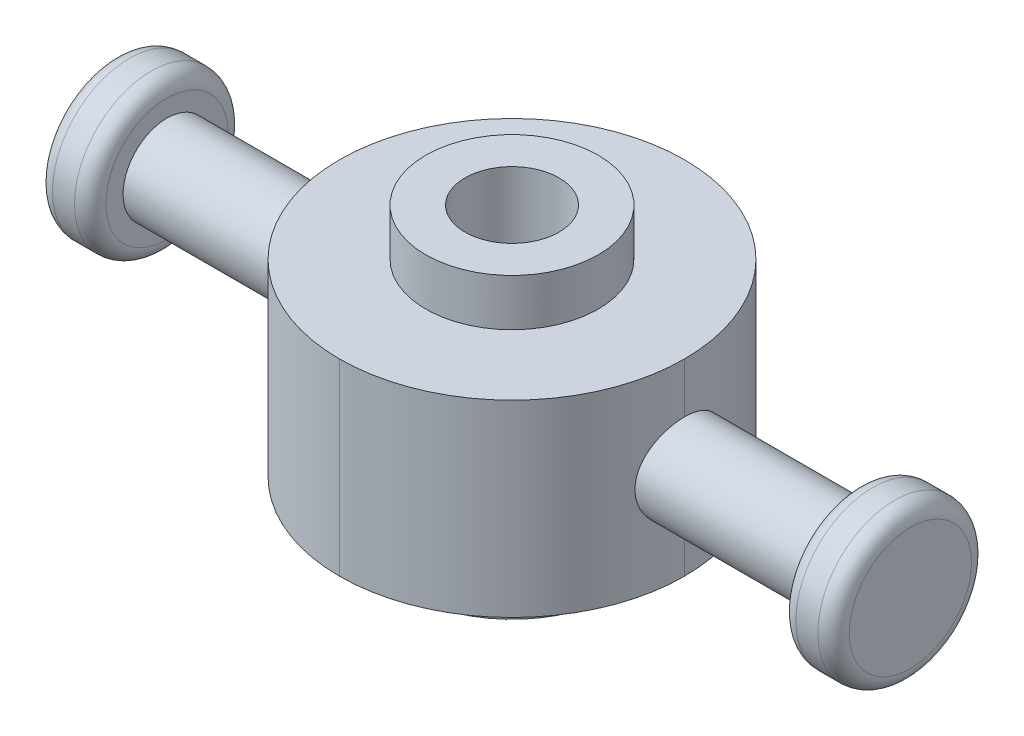
ISO-10303-21;
HEADER;
FILE_DESCRIPTION(('STEP AP214'),'2;1');
FILE_NAME('part.step','',(''),(''),'','','');
FILE_SCHEMA(('AUTOMOTIVE_DESIGN { 1 0 10303 214 1 1 1 1 }'));
ENDSEC;
DATA;
#1=APPLICATION_CONTEXT('core data for automotive mechanical design processes');
#2=APPLICATION_PROTOCOL_DEFINITION('international standard','automotive_design',2000,#1);
#3=PRODUCT_CONTEXT('',#1,'mechanical');
#4=PRODUCT('Part','Part','',(#3));
#5=PRODUCT_RELATED_PRODUCT_CATEGORY('part','',(#4));
#6=PRODUCT_DEFINITION_FORMATION('','',#4);
#7=PRODUCT_DEFINITION_CONTEXT('part definition',#1,'design');
#8=PRODUCT_DEFINITION('design','',#6,#7);
#9=PRODUCT_DEFINITION_SHAPE('','',#8);
#10=(LENGTH_UNIT() NAMED_UNIT(*) SI_UNIT(.MILLI.,.METRE.));
#11=(NAMED_UNIT(*) PLANE_ANGLE_UNIT() SI_UNIT($,.RADIAN.));
#12=(NAMED_UNIT(*) SI_UNIT($,.STERADIAN.) SOLID_ANGLE_UNIT());
#13=UNCERTAINTY_MEASURE_WITH_UNIT(LENGTH_MEASURE(1.E-05),#10,'distance_accuracy_value','');
#14=(GEOMETRIC_REPRESENTATION_CONTEXT(3) GLOBAL_UNCERTAINTY_ASSIGNED_CONTEXT((#13)) GLOBAL_UNIT_ASSIGNED_CONTEXT((#10,
#11,#12)) REPRESENTATION_CONTEXT('',''));
#15=CARTESIAN_POINT('',(0.,0.,0.));
#16=DIRECTION('',(0.,0.,1.));
#17=DIRECTION('',(1.,0.,0.));
#18=AXIS2_PLACEMENT_3D('',#15,#16,#17);
#19=CARTESIAN_POINT('',(0.,0.,-11.));
#20=DIRECTION('',(0.,-1.,0.));
#21=DIRECTION('',(0.,0.,-1.));
#22=AXIS2_PLACEMENT_3D('',#19,#20,#21);
#23=PLANE('',#22);
#24=CARTESIAN_POINT('',(5.5,0.,-5.5));
#25=DIRECTION('',(0.,-1.,0.));
#26=DIRECTION('',(0.,0.,-1.));
#27=AXIS2_PLACEMENT_3D('',#24,#25,#26);
#28=CIRCLE('',#27,5.5);
#29=CARTESIAN_POINT('',(11.,0.,-5.5));
#30=VERTEX_POINT('',#29);
#31=CARTESIAN_POINT('',(5.5,0.,0.));
#32=VERTEX_POINT('',#31);
#33=EDGE_CURVE('E106',#30,#32,#28,.T.);
#34=ORIENTED_EDGE('',*,*,#33,.T.);
#35=CARTESIAN_POINT('',(5.5,0.,-5.5));
#36=DIRECTION('',(0.,-1.,0.));
#37=DIRECTION('',(0.,0.,-1.));
#38=AXIS2_PLACEMENT_3D('',#35,#36,#37);
#39=CIRCLE('',#38,5.5);
#40=CARTESIAN_POINT('',(0.,0.,-5.5));
#41=VERTEX_POINT('',#40);
#42=EDGE_CURVE('E86',#32,#41,#39,.T.);
#43=ORIENTED_EDGE('',*,*,#42,.T.);
#44=CARTESIAN_POINT('',(5.5,0.,-5.5));
#45=DIRECTION('',(0.,-1.,0.));
#46=DIRECTION('',(0.,0.,-1.));
#47=AXIS2_PLACEMENT_3D('',#44,#45,#46);
#48=CIRCLE('',#47,5.5);
#49=CARTESIAN_POINT('',(5.5,0.,-11.));
#50=VERTEX_POINT('',#49);
#51=EDGE_CURVE('E95',#41,#50,#48,.T.);
#52=ORIENTED_EDGE('',*,*,#51,.T.);
#53=CARTESIAN_POINT('',(5.5,0.,-5.5));
#54=DIRECTION('',(0.,-1.,0.));
#55=DIRECTION('',(0.,0.,-1.));
#56=AXIS2_PLACEMENT_3D('',#53,#54,#55);
#57=CIRCLE('',#56,5.5);
#58=EDGE_CURVE('E102',#50,#30,#57,.T.);
#59=ORIENTED_EDGE('',*,*,#58,.T.);
#60=EDGE_LOOP('',(#34,#43,#52,#59));
#61=FACE_BOUND('',#60,.T.);
#62=CARTESIAN_POINT('',(5.5,0.,-5.5));
#63=DIRECTION('',(0.,-1.,0.));
#64=DIRECTION('',(0.,0.,-1.));
#65=AXIS2_PLACEMENT_3D('',#62,#63,#64);
#66=CIRCLE('',#65,3.45);
#67=CARTESIAN_POINT('',(5.5,0.,-8.95));
#68=VERTEX_POINT('',#67);
#69=EDGE_CURVE('E264',#68,#68,#66,.T.);
#70=ORIENTED_EDGE('',*,*,#69,.F.);
#71=EDGE_LOOP('',(#70));
#72=FACE_BOUND('',#71,.T.);
#73=ADVANCED_FACE('F31',(#61,#72),#23,.T.);
#74=CARTESIAN_POINT('',(0.,6.,-11.));
#75=DIRECTION('',(0.,-1.,0.));
#76=DIRECTION('',(0.,0.,-1.));
#77=AXIS2_PLACEMENT_3D('',#74,#75,#76);
#78=PLANE('',#77);
#79=CARTESIAN_POINT('',(5.5,6.,-5.5));
#80=DIRECTION('',(0.,-1.,0.));
#81=DIRECTION('',(0.,0.,-1.));
#82=AXIS2_PLACEMENT_3D('',#79,#80,#81);
#83=CIRCLE('',#82,5.5);
#84=CARTESIAN_POINT('',(5.5,6.,-11.));
#85=VERTEX_POINT('',#84);
#86=CARTESIAN_POINT('',(0.,6.,-5.5));
#87=VERTEX_POINT('',#86);
#88=EDGE_CURVE('E115',#85,#87,#83,.F.);
#89=ORIENTED_EDGE('',*,*,#88,.T.);
#90=CARTESIAN_POINT('',(5.5,6.,-5.5));
#91=DIRECTION('',(0.,-1.,0.));
#92=DIRECTION('',(0.,0.,-1.));
#93=AXIS2_PLACEMENT_3D('',#90,#91,#92);
#94=CIRCLE('',#93,5.5);
#95=CARTESIAN_POINT('',(5.5,6.,0.));
#96=VERTEX_POINT('',#95);
#97=EDGE_CURVE('E117',#87,#96,#94,.F.);
#98=ORIENTED_EDGE('',*,*,#97,.T.);
#99=CARTESIAN_POINT('',(5.5,6.,-5.5));
#100=DIRECTION('',(0.,-1.,0.));
#101=DIRECTION('',(0.,0.,-1.));
#102=AXIS2_PLACEMENT_3D('',#99,#100,#101);
#103=CIRCLE('',#102,5.5);
#104=CARTESIAN_POINT('',(11.,6.,-5.5));
#105=VERTEX_POINT('',#104);
#106=EDGE_CURVE('E108',#96,#105,#103,.F.);
#107=ORIENTED_EDGE('',*,*,#106,.T.);
#108=CARTESIAN_POINT('',(5.5,6.,-5.5));
#109=DIRECTION('',(0.,-1.,0.));
#110=DIRECTION('',(0.,0.,-1.));
#111=AXIS2_PLACEMENT_3D('',#108,#109,#110);
#112=CIRCLE('',#111,5.5);
#113=EDGE_CURVE('E110',#105,#85,#112,.F.);
#114=ORIENTED_EDGE('',*,*,#113,.T.);
#115=EDGE_LOOP('',(#89,#98,#107,#114));
#116=FACE_BOUND('',#115,.T.);
#117=CARTESIAN_POINT('',(5.5,6.,-5.5));
#118=DIRECTION('',(0.,-1.,0.));
#119=DIRECTION('',(0.,0.,-1.));
#120=AXIS2_PLACEMENT_3D('',#117,#118,#119);
#121=CIRCLE('',#120,2.75);
#122=CARTESIAN_POINT('',(5.5,6.,-8.25));
#123=VERTEX_POINT('',#122);
#124=EDGE_CURVE('E174',#123,#123,#121,.F.);
#125=ORIENTED_EDGE('',*,*,#124,.F.);
#126=EDGE_LOOP('',(#125));
#127=FACE_BOUND('',#126,.T.);
#128=ADVANCED_FACE('F162',(#116,#127),#78,.F.);
#129=CARTESIAN_POINT('',(16.5,3.,-5.5));
#130=DIRECTION('',(-1.,0.,0.));
#131=DIRECTION('',(0.,0.,1.));
#132=AXIS2_PLACEMENT_3D('',#129,#130,#131);
#133=CYLINDRICAL_SURFACE('',#132,1.4);
#134=CARTESIAN_POINT('',(11.,1.6,-5.5));
#135=CARTESIAN_POINT('',(11.0000022447727,1.5999995557012,-5.53872434659406));
#136=CARTESIAN_POINT('',(10.9995905251368,1.60160771575375,-5.57742955863176));
#137=CARTESIAN_POINT('',(10.9979630599428,1.60801867929406,-5.65455135537317));
#138=CARTESIAN_POINT('',(10.996747442384,1.61282097420146,-5.69296798504126));
#139=CARTESIAN_POINT('',(10.9919394570889,1.63194989722292,-5.80721252073091));
#140=CARTESIAN_POINT('',(10.9871856876624,1.6509988638084,-5.88225661666898));
#141=CARTESIAN_POINT('',(10.9750912492554,1.70107446756212,-6.0279545437153));
#142=CARTESIAN_POINT('',(10.9677507213219,1.73210045167422,-6.09860861394928));
#143=CARTESIAN_POINT('',(10.9512629157476,1.80520614875418,-6.23373564326211));
#144=CARTESIAN_POINT('',(10.9421151936688,1.84728858164436,-6.29820707605763));
#145=CARTESIAN_POINT('',(10.9227891616311,1.94224829669644,-6.42047118095312));
#146=CARTESIAN_POINT('',(10.9125945869704,1.99531529888484,-6.47811387133073));
#147=CARTESIAN_POINT('',(10.8924298417934,2.11033708158401,-6.58378988410229));
#148=CARTESIAN_POINT('',(10.8824597141991,2.17229354563573,-6.63182138213399));
#149=CARTESIAN_POINT('',(10.8637078500474,2.30451307478467,-6.71762181585673));
#150=CARTESIAN_POINT('',(10.8549468640427,2.37488973048697,-6.75522065109434));
#151=CARTESIAN_POINT('',(10.8398449925887,2.52122039854455,-6.81799273959371));
#152=CARTESIAN_POINT('',(10.8335035814072,2.59717319501832,-6.84316869248402));
#153=CARTESIAN_POINT('',(10.8241266919808,2.75084077936389,-6.87986582133858));
#154=CARTESIAN_POINT('',(10.8210254800264,2.82848651977037,-6.89165893867102));
#155=CARTESIAN_POINT('',(10.8182834421298,2.98471329271075,-6.90210298578702));
#156=CARTESIAN_POINT('',(10.8186421089605,3.06329418646182,-6.9007558419657));
#157=CARTESIAN_POINT('',(10.8227204138988,3.21706248762721,-6.88517379021995));
#158=CARTESIAN_POINT('',(10.8263551098166,3.292285505873,-6.87126457824727));
#159=CARTESIAN_POINT('',(10.8364403477018,3.43929289636225,-6.83147348555987));
#160=CARTESIAN_POINT('',(10.842891071127,3.51107704668275,-6.80559083329992));
#161=CARTESIAN_POINT('',(10.8579587188283,3.6500374519205,-6.74231296592621));
#162=CARTESIAN_POINT('',(10.8665975370869,3.71715783069872,-6.70480047827751));
#163=CARTESIAN_POINT('',(10.8850555293534,3.84426576952837,-6.61941042895058));
#164=CARTESIAN_POINT('',(10.8948748900809,3.90425219825196,-6.57153122666766));
#165=CARTESIAN_POINT('',(10.9149431995301,4.01724983224689,-6.46509220452992));
#166=CARTESIAN_POINT('',(10.9251962758171,4.07000306649955,-6.40625897427597));
#167=CARTESIAN_POINT('',(10.9447183978509,4.16495666822819,-6.28044046059736));
#168=CARTESIAN_POINT('',(10.9539871909547,4.20715433007936,-6.21345309361633));
#169=CARTESIAN_POINT('',(10.9705470040678,4.2799016470261,-6.07284107985504));
#170=CARTESIAN_POINT('',(10.9778295699356,4.31040172958974,-5.99918978546492));
#171=CARTESIAN_POINT('',(10.9895270513225,4.35847654086708,-5.84762119047402));
#172=CARTESIAN_POINT('',(10.9939461637272,4.37607019120933,-5.76971031560852));
#173=CARTESIAN_POINT('',(10.9977857047698,4.39127985245199,-5.65926820039757));
#174=CARTESIAN_POINT('',(10.9986149317329,4.39455047757389,-5.62748145988606));
#175=CARTESIAN_POINT('',(10.999721798288,4.3989081006414,-5.56380153013667));
#176=CARTESIAN_POINT('',(11.0000003411955,4.39999867466967,-5.53190860133021));
#177=CARTESIAN_POINT('',(11.,4.40000000000001,-5.5));
#178=B_SPLINE_CURVE_WITH_KNOTS('',3,(#134,#135,#136,#137,#138,#139,#140,#141,#142,#143,#144,
#145,#146,#147,#148,#149,#150,#151,#152,#153,#154,#155,#156,#157,#158,#159,#160,#161,#162,#163,
#164,#165,#166,#167,#168,#169,#170,#171,#172,#173,#174,#175,#176,#177),.UNSPECIFIED.,.F.,.F.,(4,
2,2,2,2,2,2,2,2,2,2,2,2,2,2,2,2,2,2,2,2,4),(0.,0.116099801420734,0.232181121483546,
0.463687796805009,0.69518185082846,0.926732906549864,1.16267863967603,1.39866911678349,
1.63830722631809,1.8778932369047,2.11251838989336,2.34710914676551,2.57578697067868,
2.80447953219948,3.03555761028784,3.26667228485382,3.50460481456319,3.74259826925057,
3.98158944314198,4.22022953710455,4.31606167734168,4.41173648832915),.UNSPECIFIED.);
#179=CARTESIAN_POINT('',(11.,1.6,-5.5));
#180=VERTEX_POINT('',#179);
#181=CARTESIAN_POINT('',(11.,4.4,-5.5));
#182=VERTEX_POINT('',#181);
#183=EDGE_CURVE('E153',#180,#182,#178,.T.);
#184=ORIENTED_EDGE('',*,*,#183,.T.);
#185=CARTESIAN_POINT('',(11.,4.4,-5.5));
#186=CARTESIAN_POINT('',(11.0000022447727,4.4000004442988,-5.46127565340594));
#187=CARTESIAN_POINT('',(10.9995905251368,4.39839228424625,-5.42257044136824));
#188=CARTESIAN_POINT('',(10.9979630599428,4.39198132070594,-5.34544864462683));
#189=CARTESIAN_POINT('',(10.996747442384,4.38717902579854,-5.30703201495874));
#190=CARTESIAN_POINT('',(10.9919394570889,4.36805010277708,-5.19278747926909));
#191=CARTESIAN_POINT('',(10.9871856876624,4.3490011361916,-5.11774338333102));
#192=CARTESIAN_POINT('',(10.9750912492554,4.29892553243788,-4.9720454562847));
#193=CARTESIAN_POINT('',(10.9677507213219,4.26789954832578,-4.90139138605072));
#194=CARTESIAN_POINT('',(10.9512629157476,4.19479385124582,-4.76626435673789));
#195=CARTESIAN_POINT('',(10.9421151936688,4.15271141835564,-4.70179292394237));
#196=CARTESIAN_POINT('',(10.9227891616311,4.05775170330356,-4.57952881904688));
#197=CARTESIAN_POINT('',(10.9125945869704,4.00468470111516,-4.52188612866927));
#198=CARTESIAN_POINT('',(10.8924298417934,3.88966291841599,-4.41621011589771));
#199=CARTESIAN_POINT('',(10.8824597141991,3.82770645436427,-4.36817861786601));
#200=CARTESIAN_POINT('',(10.8637078500474,3.69548692521533,-4.28237818414327));
#201=CARTESIAN_POINT('',(10.8549468640427,3.62511026951303,-4.24477934890566));
#202=CARTESIAN_POINT('',(10.8398449925887,3.47877960145545,-4.18200726040628));
#203=CARTESIAN_POINT('',(10.8335035814072,3.40282680498168,-4.15683130751597));
#204=CARTESIAN_POINT('',(10.8241266919808,3.24915922063611,-4.12013417866142));
#205=CARTESIAN_POINT('',(10.8210254800264,3.17151348022964,-4.10834106132898));
#206=CARTESIAN_POINT('',(10.8182834421298,3.01528670728925,-4.09789701421298));
#207=CARTESIAN_POINT('',(10.8186421089605,2.93670581353818,-4.0992441580343));
#208=CARTESIAN_POINT('',(10.8227204138988,2.78293751237279,-4.11482620978005));
#209=CARTESIAN_POINT('',(10.8263551098166,2.707714494127,-4.12873542175273));
#210=CARTESIAN_POINT('',(10.8364403477018,2.56070710363775,-4.16852651444013));
#211=CARTESIAN_POINT('',(10.842891071127,2.48892295331725,-4.19440916670008));
#212=CARTESIAN_POINT('',(10.8579587188283,2.3499625480795,-4.25768703407379));
#213=CARTESIAN_POINT('',(10.8665975370869,2.28284216930128,-4.29519952172249));
#214=CARTESIAN_POINT('',(10.8850555293534,2.15573423047163,-4.38058957104942));
#215=CARTESIAN_POINT('',(10.8948748900809,2.09574780174804,-4.42846877333234));
#216=CARTESIAN_POINT('',(10.9149431995301,1.98275016775311,-4.53490779547008));
#217=CARTESIAN_POINT('',(10.9251962758171,1.92999693350044,-4.59374102572403));
#218=CARTESIAN_POINT('',(10.9447183978509,1.83504333177181,-4.71955953940264));
#219=CARTESIAN_POINT('',(10.9539871909547,1.79284566992064,-4.78654690638367));
#220=CARTESIAN_POINT('',(10.9705470040678,1.7200983529739,-4.92715892014496));
#221=CARTESIAN_POINT('',(10.9778295699356,1.68959827041026,-5.00081021453508));
#222=CARTESIAN_POINT('',(10.9895270513225,1.64152345913293,-5.15237880952598));
#223=CARTESIAN_POINT('',(10.9939461637272,1.62392980879067,-5.23028968439148));
#224=CARTESIAN_POINT('',(10.9977857047698,1.60872014754801,-5.34073179960243));
#225=CARTESIAN_POINT('',(10.9986149317329,1.60544952242611,-5.37251854011394));
#226=CARTESIAN_POINT('',(10.999721798288,1.6010918993586,-5.43619846986333));
#227=CARTESIAN_POINT('',(11.0000003411955,1.60000132533033,-5.46809139866979));
#228=CARTESIAN_POINT('',(11.,1.59999999999999,-5.5));
#229=B_SPLINE_CURVE_WITH_KNOTS('',3,(#185,#186,#187,#188,#189,#190,#191,#192,#193,#194,#195,
#196,#197,#198,#199,#200,#201,#202,#203,#204,#205,#206,#207,#208,#209,#210,#211,#212,#213,#214,
#215,#216,#217,#218,#219,#220,#221,#222,#223,#224,#225,#226,#227,#228),.UNSPECIFIED.,.F.,.F.,(4,
2,2,2,2,2,2,2,2,2,2,2,2,2,2,2,2,2,2,2,2,4),(0.,0.116099801420733,0.232181121483546,
0.463687796805009,0.69518185082846,0.926732906549864,1.16267863967603,1.39866911678349,
1.63830722631809,1.8778932369047,2.11251838989336,2.34710914676551,2.57578697067868,
2.80447953219948,3.03555761028784,3.26667228485383,3.50460481456319,3.74259826925057,
3.98158944314198,4.22022953710455,4.31606167734168,4.41173648832915),.UNSPECIFIED.);
#230=EDGE_CURVE('E46',#182,#180,#229,.T.);
#231=ORIENTED_EDGE('',*,*,#230,.T.);
#232=EDGE_LOOP('',(#184,#231));
#233=FACE_BOUND('',#232,.T.);
#234=CARTESIAN_POINT('',(16.5,3.,-5.5));
#235=DIRECTION('',(1.,0.,0.));
#236=DIRECTION('',(0.,0.,-1.));
#237=AXIS2_PLACEMENT_3D('',#234,#235,#236);
#238=CIRCLE('',#237,1.4);
#239=CARTESIAN_POINT('',(16.5,3.,-6.9));
#240=VERTEX_POINT('',#239);
#241=EDGE_CURVE('E176',#240,#240,#238,.T.);
#242=ORIENTED_EDGE('',*,*,#241,.F.);
#243=EDGE_LOOP('',(#242));
#244=FACE_BOUND('',#243,.T.);
#245=ADVANCED_FACE('F159',(#233,#244),#133,.T.);
#246=CARTESIAN_POINT('',(-5.5,3.,-5.5));
#247=DIRECTION('',(1.,0.,0.));
#248=DIRECTION('',(0.,0.,-1.));
#249=AXIS2_PLACEMENT_3D('',#246,#247,#248);
#250=CYLINDRICAL_SURFACE('',#249,1.4);
#251=CARTESIAN_POINT('',(0.,1.6,-5.5));
#252=CARTESIAN_POINT('',(-2.2447726553491E-06,1.5999995557012,-5.46127565340594));
#253=CARTESIAN_POINT('',(0.000409474863184318,1.60160771575375,-5.42257044136824));
#254=CARTESIAN_POINT('',(0.00203694005718973,1.60801867929406,-5.34544864462683));
#255=CARTESIAN_POINT('',(0.00325255761597968,1.61282097420146,-5.30703201495874));
#256=CARTESIAN_POINT('',(0.00806054291112769,1.63194989722292,-5.19278747926909));
#257=CARTESIAN_POINT('',(0.0128143123376024,1.6509988638084,-5.11774338333102));
#258=CARTESIAN_POINT('',(0.0249087507445587,1.70107446756212,-4.9720454562847));
#259=CARTESIAN_POINT('',(0.0322492786781303,1.73210045167422,-4.90139138605072));
#260=CARTESIAN_POINT('',(0.048737084252413,1.80520614875418,-4.76626435673789));
#261=CARTESIAN_POINT('',(0.057884806331197,1.84728858164436,-4.70179292394237));
#262=CARTESIAN_POINT('',(0.0772108383688627,1.94224829669644,-4.57952881904688));
#263=CARTESIAN_POINT('',(0.0874054130296419,1.99531529888484,-4.52188612866926));
#264=CARTESIAN_POINT('',(0.107570158206625,2.11033708158401,-4.41621011589771));
#265=CARTESIAN_POINT('',(0.117540285800938,2.17229354563573,-4.36817861786601));
#266=CARTESIAN_POINT('',(0.136292149952586,2.30451307478467,-4.28237818414327));
#267=CARTESIAN_POINT('',(0.145053135957257,2.37488973048697,-4.24477934890566));
#268=CARTESIAN_POINT('',(0.160155007411269,2.52122039854455,-4.18200726040628));
#269=CARTESIAN_POINT('',(0.166496418592767,2.59717319501832,-4.15683130751597));
#270=CARTESIAN_POINT('',(0.175873308019234,2.75084077936389,-4.12013417866142));
#271=CARTESIAN_POINT('',(0.178974519973566,2.82848651977036,-4.10834106132898));
#272=CARTESIAN_POINT('',(0.18171655787024,2.98471329271075,-4.09789701421298));
#273=CARTESIAN_POINT('',(0.18135789103954,3.06329418646182,-4.0992441580343));
#274=CARTESIAN_POINT('',(0.177279586101233,3.21706248762721,-4.11482620978005));
#275=CARTESIAN_POINT('',(0.173644890183352,3.292285505873,-4.12873542175273));
#276=CARTESIAN_POINT('',(0.163559652298155,3.43929289636225,-4.16852651444013));
#277=CARTESIAN_POINT('',(0.157108928873007,3.51107704668275,-4.19440916670008));
#278=CARTESIAN_POINT('',(0.142041281171729,3.6500374519205,-4.25768703407378));
#279=CARTESIAN_POINT('',(0.133402462913115,3.71715783069872,-4.29519952172249));
#280=CARTESIAN_POINT('',(0.114944470646591,3.84426576952837,-4.38058957104942));
#281=CARTESIAN_POINT('',(0.105125109919138,3.90425219825196,-4.42846877333234));
#282=CARTESIAN_POINT('',(0.0850568004698778,4.01724983224689,-4.53490779547008));
#283=CARTESIAN_POINT('',(0.0748037241829252,4.07000306649956,-4.59374102572403));
#284=CARTESIAN_POINT('',(0.0552816021491237,4.16495666822819,-4.71955953940264));
#285=CARTESIAN_POINT('',(0.0460128090452893,4.20715433007936,-4.78654690638367));
#286=CARTESIAN_POINT('',(0.0294529959322275,4.2799016470261,-4.92715892014496));
#287=CARTESIAN_POINT('',(0.0221704300644343,4.31040172958974,-5.00081021453508));
#288=CARTESIAN_POINT('',(0.0104729486774501,4.35847654086708,-5.15237880952598));
#289=CARTESIAN_POINT('',(0.00605383627282883,4.37607019120933,-5.23028968439148));
#290=CARTESIAN_POINT('',(0.00221429523024528,4.39127985245199,-5.34073179960243));
#291=CARTESIAN_POINT('',(0.00138506826713925,4.39455047757389,-5.37251854011394));
#292=CARTESIAN_POINT('',(0.000278201711950397,4.3989081006414,-5.43619846986333));
#293=CARTESIAN_POINT('',(-3.41195511526696E-07,4.39999867466967,-5.46809139866979));
#294=CARTESIAN_POINT('',(0.,4.40000000000001,-5.5));
#295=B_SPLINE_CURVE_WITH_KNOTS('',3,(#251,#252,#253,#254,#255,#256,#257,#258,#259,#260,#261,
#262,#263,#264,#265,#266,#267,#268,#269,#270,#271,#272,#273,#274,#275,#276,#277,#278,#279,#280,
#281,#282,#283,#284,#285,#286,#287,#288,#289,#290,#291,#292,#293,#294),.UNSPECIFIED.,.F.,.F.,(4,
2,2,2,2,2,2,2,2,2,2,2,2,2,2,2,2,2,2,2,2,4),(0.,0.116099801420734,0.232181121483546,
0.463687796805009,0.69518185082846,0.926732906549864,1.16267863967603,1.39866911678349,
1.63830722631809,1.87789323690469,2.11251838989336,2.34710914676551,2.57578697067868,
2.80447953219948,3.03555761028783,3.26667228485382,3.50460481456319,3.74259826925057,
3.98158944314198,4.22022953710455,4.31606167734168,4.41173648832915),.UNSPECIFIED.);
#296=CARTESIAN_POINT('',(0.,1.6,-5.5));
#297=VERTEX_POINT('',#296);
#298=CARTESIAN_POINT('',(0.,4.4,-5.5));
#299=VERTEX_POINT('',#298);
#300=EDGE_CURVE('E88',#297,#299,#295,.T.);
#301=ORIENTED_EDGE('',*,*,#300,.T.);
#302=CARTESIAN_POINT('',(0.,4.4,-5.5));
#303=CARTESIAN_POINT('',(-2.2447726553295E-06,4.4000004442988,-5.53872434659406));
#304=CARTESIAN_POINT('',(0.000409474863184343,4.39839228424625,-5.57742955863176));
#305=CARTESIAN_POINT('',(0.00203694005718975,4.39198132070594,-5.65455135537317));
#306=CARTESIAN_POINT('',(0.0032525576159797,4.38717902579854,-5.69296798504126));
#307=CARTESIAN_POINT('',(0.00806054291112768,4.36805010277708,-5.80721252073091));
#308=CARTESIAN_POINT('',(0.0128143123376023,4.3490011361916,-5.88225661666898));
#309=CARTESIAN_POINT('',(0.0249087507445587,4.29892553243788,-6.0279545437153));
#310=CARTESIAN_POINT('',(0.0322492786781304,4.26789954832578,-6.09860861394928));
#311=CARTESIAN_POINT('',(0.0487370842524131,4.19479385124582,-6.23373564326211));
#312=CARTESIAN_POINT('',(0.057884806331197,4.15271141835564,-6.29820707605763));
#313=CARTESIAN_POINT('',(0.0772108383688627,4.05775170330356,-6.42047118095312));
#314=CARTESIAN_POINT('',(0.0874054130296419,4.00468470111516,-6.47811387133073));
#315=CARTESIAN_POINT('',(0.107570158206625,3.88966291841599,-6.58378988410229));
#316=CARTESIAN_POINT('',(0.117540285800938,3.82770645436427,-6.63182138213399));
#317=CARTESIAN_POINT('',(0.136292149952586,3.69548692521533,-6.71762181585673));
#318=CARTESIAN_POINT('',(0.145053135957257,3.62511026951303,-6.75522065109434));
#319=CARTESIAN_POINT('',(0.160155007411269,3.47877960145545,-6.81799273959371));
#320=CARTESIAN_POINT('',(0.166496418592767,3.40282680498168,-6.84316869248402));
#321=CARTESIAN_POINT('',(0.175873308019233,3.24915922063611,-6.87986582133858));
#322=CARTESIAN_POINT('',(0.178974519973565,3.17151348022963,-6.89165893867102));
#323=CARTESIAN_POINT('',(0.181716557870239,3.01528670728925,-6.90210298578702));
#324=CARTESIAN_POINT('',(0.181357891039539,2.93670581353818,-6.9007558419657));
#325=CARTESIAN_POINT('',(0.177279586101233,2.78293751237279,-6.88517379021995));
#326=CARTESIAN_POINT('',(0.173644890183353,2.707714494127,-6.87126457824727));
#327=CARTESIAN_POINT('',(0.163559652298155,2.56070710363775,-6.83147348555987));
#328=CARTESIAN_POINT('',(0.157108928873007,2.48892295331725,-6.80559083329992));
#329=CARTESIAN_POINT('',(0.142041281171729,2.3499625480795,-6.74231296592621));
#330=CARTESIAN_POINT('',(0.133402462913114,2.28284216930128,-6.70480047827751));
#331=CARTESIAN_POINT('',(0.11494447064659,2.15573423047163,-6.61941042895058));
#332=CARTESIAN_POINT('',(0.105125109919138,2.09574780174804,-6.57153122666766));
#333=CARTESIAN_POINT('',(0.0850568004698776,1.98275016775311,-6.46509220452992));
#334=CARTESIAN_POINT('',(0.0748037241829249,1.92999693350045,-6.40625897427597));
#335=CARTESIAN_POINT('',(0.0552816021491234,1.83504333177181,-6.28044046059736));
#336=CARTESIAN_POINT('',(0.046012809045289,1.79284566992064,-6.21345309361633));
#337=CARTESIAN_POINT('',(0.0294529959322272,1.7200983529739,-6.07284107985504));
#338=CARTESIAN_POINT('',(0.0221704300644341,1.68959827041026,-5.99918978546492));
#339=CARTESIAN_POINT('',(0.0104729486774499,1.64152345913293,-5.84762119047402));
#340=CARTESIAN_POINT('',(0.00605383627282864,1.62392980879067,-5.76971031560852));
#341=CARTESIAN_POINT('',(0.0022142952302451,1.60872014754801,-5.65926820039757));
#342=CARTESIAN_POINT('',(0.00138506826713907,1.60544952242611,-5.62748145988606));
#343=CARTESIAN_POINT('',(0.000278201711950217,1.6010918993586,-5.56380153013667));
#344=CARTESIAN_POINT('',(-3.41195511706282E-07,1.60000132533033,-5.53190860133021));
#345=CARTESIAN_POINT('',(0.,1.59999999999999,-5.5));
#346=B_SPLINE_CURVE_WITH_KNOTS('',3,(#302,#303,#304,#305,#306,#307,#308,#309,#310,#311,#312,
#313,#314,#315,#316,#317,#318,#319,#320,#321,#322,#323,#324,#325,#326,#327,#328,#329,#330,#331,
#332,#333,#334,#335,#336,#337,#338,#339,#340,#341,#342,#343,#344,#345),.UNSPECIFIED.,.F.,.F.,(4,
2,2,2,2,2,2,2,2,2,2,2,2,2,2,2,2,2,2,2,2,4),(0.,0.116099801420734,0.232181121483546,
0.463687796805009,0.69518185082846,0.926732906549864,1.16267863967603,1.39866911678349,
1.63830722631809,1.8778932369047,2.11251838989336,2.34710914676551,2.57578697067868,
2.80447953219948,3.03555761028783,3.26667228485382,3.50460481456319,3.74259826925057,
3.98158944314198,4.22022953710455,4.31606167734168,4.41173648832915),.UNSPECIFIED.);
#347=EDGE_CURVE('E126',#299,#297,#346,.T.);
#348=ORIENTED_EDGE('',*,*,#347,.T.);
#349=EDGE_LOOP('',(#301,#348));
#350=FACE_BOUND('',#349,.T.);
#351=CARTESIAN_POINT('',(-5.5,3.,-5.5));
#352=DIRECTION('',(-1.,0.,0.));
#353=DIRECTION('',(0.,0.,1.));
#354=AXIS2_PLACEMENT_3D('',#351,#352,#353);
#355=CIRCLE('',#354,1.4);
#356=CARTESIAN_POINT('',(-5.5,3.,-4.1));
#357=VERTEX_POINT('',#356);
#358=EDGE_CURVE('E180',#357,#357,#355,.T.);
#359=ORIENTED_EDGE('',*,*,#358,.F.);
#360=EDGE_LOOP('',(#359));
#361=FACE_BOUND('',#360,.T.);
#362=ADVANCED_FACE('F132',(#350,#361),#250,.T.);
#363=CARTESIAN_POINT('',(5.5,7.5,-5.5));
#364=DIRECTION('',(0.,-1.,0.));
#365=DIRECTION('',(0.,0.,-1.));
#366=AXIS2_PLACEMENT_3D('',#363,#364,#365);
#367=CYLINDRICAL_SURFACE('',#366,2.75);
#368=CARTESIAN_POINT('',(5.5,7.5,-5.5));
#369=DIRECTION('',(0.,1.,0.));
#370=DIRECTION('',(0.,0.,1.));
#371=AXIS2_PLACEMENT_3D('',#368,#369,#370);
#372=CIRCLE('',#371,2.75);
#373=CARTESIAN_POINT('',(5.5,7.5,-2.75));
#374=VERTEX_POINT('',#373);
#375=EDGE_CURVE('E258',#374,#374,#372,.T.);
#376=ORIENTED_EDGE('',*,*,#375,.F.);
#377=EDGE_LOOP('',(#376));
#378=FACE_BOUND('',#377,.T.);
#379=ORIENTED_EDGE('',*,*,#124,.T.);
#380=EDGE_LOOP('',(#379));
#381=FACE_BOUND('',#380,.T.);
#382=ADVANCED_FACE('F248',(#378,#381),#367,.T.);
#383=CARTESIAN_POINT('',(5.5,7.5,-5.5));
#384=DIRECTION('',(0.,1.,0.));
#385=DIRECTION('',(0.,0.,1.));
#386=AXIS2_PLACEMENT_3D('',#383,#384,#385);
#387=PLANE('',#386);
#388=CARTESIAN_POINT('',(5.5,7.5,-5.5));
#389=DIRECTION('',(0.,-1.,0.));
#390=DIRECTION('',(0.,0.,-1.));
#391=AXIS2_PLACEMENT_3D('',#388,#389,#390);
#392=CIRCLE('',#391,1.5);
#393=CARTESIAN_POINT('',(5.5,7.5,-7.));
#394=VERTEX_POINT('',#393);
#395=EDGE_CURVE('E268',#394,#394,#392,.T.);
#396=ORIENTED_EDGE('',*,*,#395,.T.);
#397=EDGE_LOOP('',(#396));
#398=FACE_BOUND('',#397,.T.);
#399=ORIENTED_EDGE('',*,*,#375,.T.);
#400=EDGE_LOOP('',(#399));
#401=FACE_BOUND('',#400,.T.);
#402=ADVANCED_FACE('F245',(#398,#401),#387,.T.);
#403=CARTESIAN_POINT('',(5.5,-1.5,-5.5));
#404=DIRECTION('',(0.,1.,0.));
#405=DIRECTION('',(0.,0.,1.));
#406=AXIS2_PLACEMENT_3D('',#403,#404,#405);
#407=CYLINDRICAL_SURFACE('',#406,3.45);
#408=CARTESIAN_POINT('',(5.5,-1.5,-5.5));
#409=DIRECTION('',(0.,-1.,0.));
#410=DIRECTION('',(0.,0.,-1.));
#411=AXIS2_PLACEMENT_3D('',#408,#409,#410);
#412=CIRCLE('',#411,3.45);
#413=CARTESIAN_POINT('',(5.5,-1.5,-8.95));
#414=VERTEX_POINT('',#413);
#415=EDGE_CURVE('E260',#414,#414,#412,.T.);
#416=ORIENTED_EDGE('',*,*,#415,.F.);
#417=EDGE_LOOP('',(#416));
#418=FACE_BOUND('',#417,.T.);
#419=ORIENTED_EDGE('',*,*,#69,.T.);
#420=EDGE_LOOP('',(#419));
#421=FACE_BOUND('',#420,.T.);
#422=ADVANCED_FACE('F241',(#418,#421),#407,.T.);
#423=CARTESIAN_POINT('',(5.5,-1.5,-5.5));
#424=DIRECTION('',(0.,-1.,0.));
#425=DIRECTION('',(0.,0.,-1.));
#426=AXIS2_PLACEMENT_3D('',#423,#424,#425);
#427=PLANE('',#426);
#428=CARTESIAN_POINT('',(5.5,-1.5,-5.5));
#429=DIRECTION('',(0.,-1.,0.));
#430=DIRECTION('',(0.,0.,-1.));
#431=AXIS2_PLACEMENT_3D('',#428,#429,#430);
#432=CIRCLE('',#431,1.5);
#433=CARTESIAN_POINT('',(5.5,-1.5,-7.));
#434=VERTEX_POINT('',#433);
#435=EDGE_CURVE('E195',#434,#434,#432,.T.);
#436=ORIENTED_EDGE('',*,*,#435,.F.);
#437=EDGE_LOOP('',(#436));
#438=FACE_BOUND('',#437,.T.);
#439=ORIENTED_EDGE('',*,*,#415,.T.);
#440=EDGE_LOOP('',(#439));
#441=FACE_BOUND('',#440,.T.);
#442=ADVANCED_FACE('F236',(#438,#441),#427,.T.);
#443=CARTESIAN_POINT('',(16.5,3.,-5.5));
#444=DIRECTION('',(1.,0.,0.));
#445=DIRECTION('',(0.,0.,-1.));
#446=AXIS2_PLACEMENT_3D('',#443,#444,#445);
#447=PLANE('',#446);
#448=CARTESIAN_POINT('',(16.5,3.,-5.5));
#449=DIRECTION('',(1.,0.,0.));
#450=DIRECTION('',(0.,0.,-1.));
#451=AXIS2_PLACEMENT_3D('',#448,#449,#450);
#452=CIRCLE('',#451,1.95);
#453=CARTESIAN_POINT('',(16.5,3.,-7.45));
#454=VERTEX_POINT('',#453);
#455=EDGE_CURVE('E40',#454,#454,#452,.F.);
#456=ORIENTED_EDGE('',*,*,#455,.T.);
#457=EDGE_LOOP('',(#456));
#458=FACE_BOUND('',#457,.T.);
#459=ORIENTED_EDGE('',*,*,#241,.T.);
#460=EDGE_LOOP('',(#459));
#461=FACE_BOUND('',#460,.T.);
#462=ADVANCED_FACE('F215',(#458,#461),#447,.F.);
#463=CARTESIAN_POINT('',(18.2,3.,-5.5));
#464=DIRECTION('',(-1.,0.,0.));
#465=DIRECTION('',(0.,0.,1.));
#466=AXIS2_PLACEMENT_3D('',#463,#464,#465);
#467=CYLINDRICAL_SURFACE('',#466,2.45);
#468=CARTESIAN_POINT('',(17.7,3.,-5.5));
#469=DIRECTION('',(1.,0.,0.));
#470=DIRECTION('',(0.,0.,-1.));
#471=AXIS2_PLACEMENT_3D('',#468,#469,#470);
#472=CIRCLE('',#471,2.45);
#473=CARTESIAN_POINT('',(17.7,3.,-7.95));
#474=VERTEX_POINT('',#473);
#475=EDGE_CURVE('E210',#474,#474,#472,.F.);
#476=ORIENTED_EDGE('',*,*,#475,.T.);
#477=EDGE_LOOP('',(#476));
#478=FACE_BOUND('',#477,.T.);
#479=CARTESIAN_POINT('',(17.,3.,-5.5));
#480=DIRECTION('',(1.,0.,0.));
#481=DIRECTION('',(0.,0.,-1.));
#482=AXIS2_PLACEMENT_3D('',#479,#480,#481);
#483=CIRCLE('',#482,2.45);
#484=CARTESIAN_POINT('',(17.,3.,-7.95));
#485=VERTEX_POINT('',#484);
#486=EDGE_CURVE('E207',#485,#485,#483,.T.);
#487=ORIENTED_EDGE('',*,*,#486,.T.);
#488=EDGE_LOOP('',(#487));
#489=FACE_BOUND('',#488,.T.);
#490=ADVANCED_FACE('F224',(#478,#489),#467,.T.);
#491=CARTESIAN_POINT('',(18.2,3.,-5.5));
#492=DIRECTION('',(1.,0.,0.));
#493=DIRECTION('',(0.,0.,-1.));
#494=AXIS2_PLACEMENT_3D('',#491,#492,#493);
#495=PLANE('',#494);
#496=CARTESIAN_POINT('',(18.2,3.,-5.5));
#497=DIRECTION('',(1.,0.,0.));
#498=DIRECTION('',(0.,0.,-1.));
#499=AXIS2_PLACEMENT_3D('',#496,#497,#498);
#500=CIRCLE('',#499,1.95);
#501=CARTESIAN_POINT('',(18.2,3.,-7.45));
#502=VERTEX_POINT('',#501);
#503=EDGE_CURVE('E204',#502,#502,#500,.T.);
#504=ORIENTED_EDGE('',*,*,#503,.T.);
#505=EDGE_LOOP('',(#504));
#506=FACE_BOUND('',#505,.T.);
#507=ADVANCED_FACE('F226',(#506),#495,.T.);
#508=CARTESIAN_POINT('',(-5.5,3.,-5.5));
#509=DIRECTION('',(-1.,0.,0.));
#510=DIRECTION('',(0.,0.,1.));
#511=AXIS2_PLACEMENT_3D('',#508,#509,#510);
#512=PLANE('',#511);
#513=CARTESIAN_POINT('',(-5.5,3.,-5.5));
#514=DIRECTION('',(-1.,0.,0.));
#515=DIRECTION('',(0.,0.,1.));
#516=AXIS2_PLACEMENT_3D('',#513,#514,#515);
#517=CIRCLE('',#516,1.95);
#518=CARTESIAN_POINT('',(-5.5,3.,-3.55));
#519=VERTEX_POINT('',#518);
#520=EDGE_CURVE('E11',#519,#519,#517,.F.);
#521=ORIENTED_EDGE('',*,*,#520,.T.);
#522=EDGE_LOOP('',(#521));
#523=FACE_BOUND('',#522,.T.);
#524=ORIENTED_EDGE('',*,*,#358,.T.);
#525=EDGE_LOOP('',(#524));
#526=FACE_BOUND('',#525,.T.);
#527=ADVANCED_FACE('F233',(#523,#526),#512,.F.);
#528=CARTESIAN_POINT('',(-7.2,3.,-5.5));
#529=DIRECTION('',(1.,0.,0.));
#530=DIRECTION('',(0.,0.,-1.));
#531=AXIS2_PLACEMENT_3D('',#528,#529,#530);
#532=CYLINDRICAL_SURFACE('',#531,2.45);
#533=CARTESIAN_POINT('',(-6.7,3.,-5.5));
#534=DIRECTION('',(-1.,0.,0.));
#535=DIRECTION('',(0.,0.,1.));
#536=AXIS2_PLACEMENT_3D('',#533,#534,#535);
#537=CIRCLE('',#536,2.45);
#538=CARTESIAN_POINT('',(-6.7,3.,-3.05));
#539=VERTEX_POINT('',#538);
#540=EDGE_CURVE('E201',#539,#539,#537,.F.);
#541=ORIENTED_EDGE('',*,*,#540,.T.);
#542=EDGE_LOOP('',(#541));
#543=FACE_BOUND('',#542,.T.);
#544=CARTESIAN_POINT('',(-6.,3.,-5.5));
#545=DIRECTION('',(-1.,0.,0.));
#546=DIRECTION('',(0.,0.,1.));
#547=AXIS2_PLACEMENT_3D('',#544,#545,#546);
#548=CIRCLE('',#547,2.45);
#549=CARTESIAN_POINT('',(-6.,3.,-3.05));
#550=VERTEX_POINT('',#549);
#551=EDGE_CURVE('E198',#550,#550,#548,.T.);
#552=ORIENTED_EDGE('',*,*,#551,.T.);
#553=EDGE_LOOP('',(#552));
#554=FACE_BOUND('',#553,.T.);
#555=ADVANCED_FACE('F289',(#543,#554),#532,.T.);
#556=CARTESIAN_POINT('',(-7.2,3.,-5.5));
#557=DIRECTION('',(-1.,0.,0.));
#558=DIRECTION('',(0.,0.,1.));
#559=AXIS2_PLACEMENT_3D('',#556,#557,#558);
#560=PLANE('',#559);
#561=CARTESIAN_POINT('',(-7.2,3.,-5.5));
#562=DIRECTION('',(-1.,0.,0.));
#563=DIRECTION('',(0.,0.,1.));
#564=AXIS2_PLACEMENT_3D('',#561,#562,#563);
#565=CIRCLE('',#564,1.95);
#566=CARTESIAN_POINT('',(-7.2,3.,-3.55));
#567=VERTEX_POINT('',#566);
#568=EDGE_CURVE('E152',#567,#567,#565,.T.);
#569=ORIENTED_EDGE('',*,*,#568,.T.);
#570=EDGE_LOOP('',(#569));
#571=FACE_BOUND('',#570,.T.);
#572=ADVANCED_FACE('F278',(#571),#560,.T.);
#573=CARTESIAN_POINT('',(5.5,7.5,-5.5));
#574=DIRECTION('',(0.,-1.,0.));
#575=DIRECTION('',(0.,0.,-1.));
#576=AXIS2_PLACEMENT_3D('',#573,#574,#575);
#577=CYLINDRICAL_SURFACE('',#576,1.5);
#578=ORIENTED_EDGE('',*,*,#395,.F.);
#579=EDGE_LOOP('',(#578));
#580=FACE_BOUND('',#579,.T.);
#581=ORIENTED_EDGE('',*,*,#435,.T.);
#582=EDGE_LOOP('',(#581));
#583=FACE_BOUND('',#582,.T.);
#584=ADVANCED_FACE('F275',(#580,#583),#577,.F.);
#585=CARTESIAN_POINT('',(5.5,6.,-5.5));
#586=DIRECTION('',(0.,-1.,0.));
#587=DIRECTION('',(0.,0.,-1.));
#588=AXIS2_PLACEMENT_3D('',#585,#586,#587);
#589=CYLINDRICAL_SURFACE('',#588,5.5);
#590=DIRECTION('',(0.,-1.,0.));
#591=VECTOR('',#590,1.);
#592=CARTESIAN_POINT('',(11.,6.,-5.5));
#593=LINE('',#592,#591);
#594=EDGE_CURVE('E91',#30,#180,#593,.F.);
#595=ORIENTED_EDGE('',*,*,#594,.F.);
#596=ORIENTED_EDGE('',*,*,#58,.F.);
#597=DIRECTION('',(0.,-1.,0.));
#598=VECTOR('',#597,1.);
#599=CARTESIAN_POINT('',(5.5,6.,-11.));
#600=LINE('',#599,#598);
#601=EDGE_CURVE('E99',#85,#50,#600,.T.);
#602=ORIENTED_EDGE('',*,*,#601,.F.);
#603=ORIENTED_EDGE('',*,*,#113,.F.);
#604=DIRECTION('',(0.,-1.,0.));
#605=VECTOR('',#604,1.);
#606=CARTESIAN_POINT('',(11.,6.,-5.5));
#607=LINE('',#606,#605);
#608=EDGE_CURVE('E188',#182,#105,#607,.F.);
#609=ORIENTED_EDGE('',*,*,#608,.F.);
#610=ORIENTED_EDGE('',*,*,#183,.F.);
#611=EDGE_LOOP('',(#595,#596,#602,#603,#609,#610));
#612=FACE_BOUND('',#611,.T.);
#613=ADVANCED_FACE('F186',(#612),#589,.T.);
#614=CARTESIAN_POINT('',(5.5,6.,-5.5));
#615=DIRECTION('',(0.,-1.,0.));
#616=DIRECTION('',(0.,0.,-1.));
#617=AXIS2_PLACEMENT_3D('',#614,#615,#616);
#618=CYLINDRICAL_SURFACE('',#617,5.5);
#619=ORIENTED_EDGE('',*,*,#601,.T.);
#620=ORIENTED_EDGE('',*,*,#51,.F.);
#621=DIRECTION('',(0.,-1.,0.));
#622=VECTOR('',#621,1.);
#623=CARTESIAN_POINT('',(0.,6.,-5.5));
#624=LINE('',#623,#622);
#625=EDGE_CURVE('E82',#297,#41,#624,.T.);
#626=ORIENTED_EDGE('',*,*,#625,.F.);
#627=ORIENTED_EDGE('',*,*,#347,.F.);
#628=DIRECTION('',(0.,-1.,0.));
#629=VECTOR('',#628,1.);
#630=CARTESIAN_POINT('',(0.,6.,-5.5));
#631=LINE('',#630,#629);
#632=EDGE_CURVE('E92',#87,#299,#631,.T.);
#633=ORIENTED_EDGE('',*,*,#632,.F.);
#634=ORIENTED_EDGE('',*,*,#88,.F.);
#635=EDGE_LOOP('',(#619,#620,#626,#627,#633,#634));
#636=FACE_BOUND('',#635,.T.);
#637=ADVANCED_FACE('F96',(#636),#618,.T.);
#638=CARTESIAN_POINT('',(5.5,6.,-5.5));
#639=DIRECTION('',(0.,-1.,0.));
#640=DIRECTION('',(0.,0.,-1.));
#641=AXIS2_PLACEMENT_3D('',#638,#639,#640);
#642=CYLINDRICAL_SURFACE('',#641,5.5);
#643=ORIENTED_EDGE('',*,*,#608,.T.);
#644=ORIENTED_EDGE('',*,*,#106,.F.);
#645=DIRECTION('',(0.,-1.,0.));
#646=VECTOR('',#645,1.);
#647=CARTESIAN_POINT('',(5.5,6.,0.));
#648=LINE('',#647,#646);
#649=EDGE_CURVE('E157',#32,#96,#648,.F.);
#650=ORIENTED_EDGE('',*,*,#649,.F.);
#651=ORIENTED_EDGE('',*,*,#33,.F.);
#652=ORIENTED_EDGE('',*,*,#594,.T.);
#653=ORIENTED_EDGE('',*,*,#230,.F.);
#654=EDGE_LOOP('',(#643,#644,#650,#651,#652,#653));
#655=FACE_BOUND('',#654,.T.);
#656=ADVANCED_FACE('F141',(#655),#642,.T.);
#657=CARTESIAN_POINT('',(5.5,6.,-5.5));
#658=DIRECTION('',(0.,-1.,0.));
#659=DIRECTION('',(0.,0.,-1.));
#660=AXIS2_PLACEMENT_3D('',#657,#658,#659);
#661=CYLINDRICAL_SURFACE('',#660,5.5);
#662=ORIENTED_EDGE('',*,*,#300,.F.);
#663=ORIENTED_EDGE('',*,*,#625,.T.);
#664=ORIENTED_EDGE('',*,*,#42,.F.);
#665=ORIENTED_EDGE('',*,*,#649,.T.);
#666=ORIENTED_EDGE('',*,*,#97,.F.);
#667=ORIENTED_EDGE('',*,*,#632,.T.);
#668=EDGE_LOOP('',(#662,#663,#664,#665,#666,#667));
#669=FACE_BOUND('',#668,.T.);
#670=ADVANCED_FACE('F84',(#669),#661,.T.);
#671=CARTESIAN_POINT('',(-6.7,3.,-5.5));
#672=DIRECTION('',(-1.,0.,0.));
#673=DIRECTION('',(0.,0.,1.));
#674=AXIS2_PLACEMENT_3D('',#671,#672,#673);
#675=TOROIDAL_SURFACE('',#674,1.95,0.5);
#676=ORIENTED_EDGE('',*,*,#540,.F.);
#677=EDGE_LOOP('',(#676));
#678=FACE_BOUND('',#677,.T.);
#679=ORIENTED_EDGE('',*,*,#568,.F.);
#680=EDGE_LOOP('',(#679));
#681=FACE_BOUND('',#680,.T.);
#682=ADVANCED_FACE('F140',(#678,#681),#675,.T.);
#683=CARTESIAN_POINT('',(17.7,3.,-5.5));
#684=DIRECTION('',(1.,0.,0.));
#685=DIRECTION('',(0.,0.,-1.));
#686=AXIS2_PLACEMENT_3D('',#683,#684,#685);
#687=TOROIDAL_SURFACE('',#686,1.95,0.5);
#688=ORIENTED_EDGE('',*,*,#475,.F.);
#689=EDGE_LOOP('',(#688));
#690=FACE_BOUND('',#689,.T.);
#691=ORIENTED_EDGE('',*,*,#503,.F.);
#692=EDGE_LOOP('',(#691));
#693=FACE_BOUND('',#692,.T.);
#694=ADVANCED_FACE('F221',(#690,#693),#687,.T.);
#695=CARTESIAN_POINT('',(17.,3.,-5.5));
#696=DIRECTION('',(1.,0.,0.));
#697=DIRECTION('',(0.,0.,-1.));
#698=AXIS2_PLACEMENT_3D('',#695,#696,#697);
#699=TOROIDAL_SURFACE('',#698,1.95,0.5);
#700=ORIENTED_EDGE('',*,*,#455,.F.);
#701=EDGE_LOOP('',(#700));
#702=FACE_BOUND('',#701,.T.);
#703=ORIENTED_EDGE('',*,*,#486,.F.);
#704=EDGE_LOOP('',(#703));
#705=FACE_BOUND('',#704,.T.);
#706=ADVANCED_FACE('F218',(#702,#705),#699,.T.);
#707=CARTESIAN_POINT('',(-6.,3.,-5.5));
#708=DIRECTION('',(-1.,0.,0.));
#709=DIRECTION('',(0.,0.,1.));
#710=AXIS2_PLACEMENT_3D('',#707,#708,#709);
#711=TOROIDAL_SURFACE('',#710,1.95,0.5);
#712=ORIENTED_EDGE('',*,*,#520,.F.);
#713=EDGE_LOOP('',(#712));
#714=FACE_BOUND('',#713,.T.);
#715=ORIENTED_EDGE('',*,*,#551,.F.);
#716=EDGE_LOOP('',(#715));
#717=FACE_BOUND('',#716,.T.);
#718=ADVANCED_FACE('F33',(#714,#717),#711,.T.);
#719=CLOSED_SHELL('',(#73,#128,#245,#362,#382,#402,#422,#442,#462,#490,#507,#527,#555,#572,#584,
#613,#637,#656,#670,#682,#694,#706,#718));
#720=MANIFOLD_SOLID_BREP('B2',#719);
#721=ADVANCED_BREP_SHAPE_REPRESENTATION('',(#18,#720),#14);
#722=SHAPE_DEFINITION_REPRESENTATION(#9,#721);
ENDSEC;
END-ISO-10303-21;
